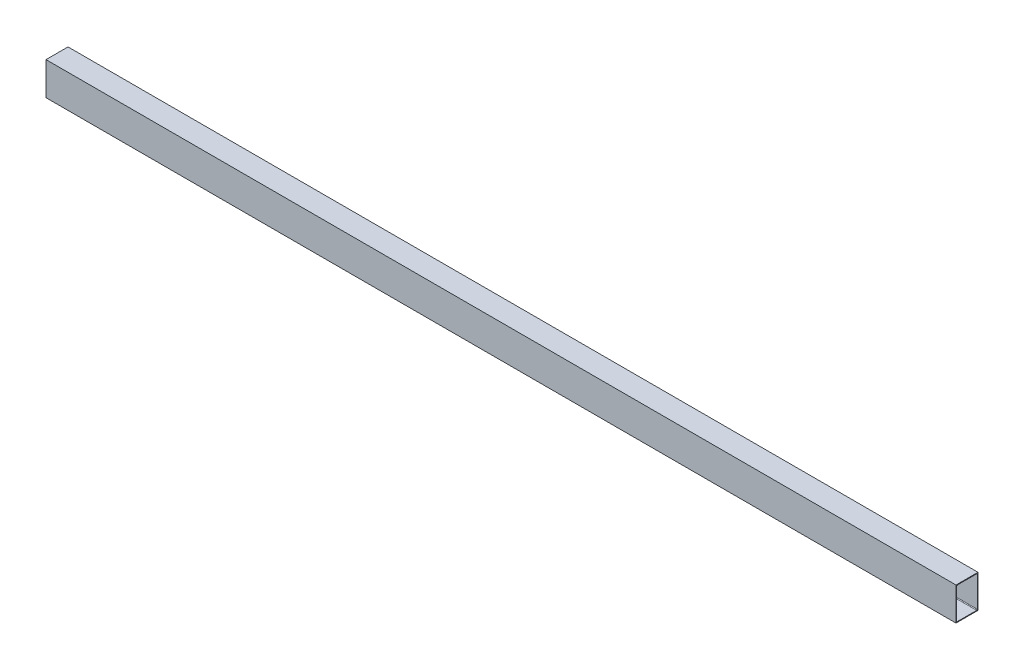
ISO-10303-21;
HEADER;
FILE_DESCRIPTION(('STEP AP214'),'2;1');
FILE_NAME('part.step','',(''),(''),'','','');
FILE_SCHEMA(('AUTOMOTIVE_DESIGN { 1 0 10303 214 1 1 1 1 }'));
ENDSEC;
DATA;
#1=APPLICATION_CONTEXT('core data for automotive mechanical design processes');
#2=APPLICATION_PROTOCOL_DEFINITION('international standard','automotive_design',2000,#1);
#3=PRODUCT_CONTEXT('',#1,'mechanical');
#4=PRODUCT('Part','Part','',(#3));
#5=PRODUCT_RELATED_PRODUCT_CATEGORY('part','',(#4));
#6=PRODUCT_DEFINITION_FORMATION('','',#4);
#7=PRODUCT_DEFINITION_CONTEXT('part definition',#1,'design');
#8=PRODUCT_DEFINITION('design','',#6,#7);
#9=PRODUCT_DEFINITION_SHAPE('','',#8);
#10=(LENGTH_UNIT() NAMED_UNIT(*) SI_UNIT(.MILLI.,.METRE.));
#11=(NAMED_UNIT(*) PLANE_ANGLE_UNIT() SI_UNIT($,.RADIAN.));
#12=(NAMED_UNIT(*) SI_UNIT($,.STERADIAN.) SOLID_ANGLE_UNIT());
#13=UNCERTAINTY_MEASURE_WITH_UNIT(LENGTH_MEASURE(1.E-05),#10,'distance_accuracy_value','');
#14=(GEOMETRIC_REPRESENTATION_CONTEXT(3) GLOBAL_UNCERTAINTY_ASSIGNED_CONTEXT((#13)) GLOBAL_UNIT_ASSIGNED_CONTEXT((#10,
#11,#12)) REPRESENTATION_CONTEXT('',''));
#15=CARTESIAN_POINT('',(0.,0.,0.));
#16=DIRECTION('',(0.,0.,1.));
#17=DIRECTION('',(1.,0.,0.));
#18=AXIS2_PLACEMENT_3D('',#15,#16,#17);
#19=CARTESIAN_POINT('',(4200.,0.,0.));
#20=DIRECTION('',(1.,0.,0.));
#21=DIRECTION('',(0.,0.,-1.));
#22=AXIS2_PLACEMENT_3D('',#19,#20,#21);
#23=PLANE('',#22);
#24=DIRECTION('',(0.,1.,0.));
#25=VECTOR('',#24,1.);
#26=CARTESIAN_POINT('',(4200.,0.,0.));
#27=LINE('',#26,#25);
#28=CARTESIAN_POINT('',(4200.,0.,0.));
#29=VERTEX_POINT('',#28);
#30=CARTESIAN_POINT('',(4200.,152.4,0.));
#31=VERTEX_POINT('',#30);
#32=EDGE_CURVE('E187',#29,#31,#27,.T.);
#33=ORIENTED_EDGE('',*,*,#32,.T.);
#34=DIRECTION('',(0.,0.,1.));
#35=VECTOR('',#34,1.);
#36=CARTESIAN_POINT('',(4200.,152.4,0.));
#37=LINE('',#36,#35);
#38=CARTESIAN_POINT('',(4200.,152.4,101.6));
#39=VERTEX_POINT('',#38);
#40=EDGE_CURVE('E190',#31,#39,#37,.T.);
#41=ORIENTED_EDGE('',*,*,#40,.T.);
#42=DIRECTION('',(0.,-1.,0.));
#43=VECTOR('',#42,1.);
#44=CARTESIAN_POINT('',(4200.,0.,101.6));
#45=LINE('',#44,#43);
#46=CARTESIAN_POINT('',(4200.,0.,101.6));
#47=VERTEX_POINT('',#46);
#48=EDGE_CURVE('E193',#39,#47,#45,.T.);
#49=ORIENTED_EDGE('',*,*,#48,.T.);
#50=DIRECTION('',(0.,0.,-1.));
#51=VECTOR('',#50,1.);
#52=CARTESIAN_POINT('',(4200.,0.,0.));
#53=LINE('',#52,#51);
#54=EDGE_CURVE('E195',#47,#29,#53,.T.);
#55=ORIENTED_EDGE('',*,*,#54,.T.);
#56=EDGE_LOOP('',(#33,#41,#49,#55));
#57=FACE_BOUND('',#56,.T.);
#58=DIRECTION('',(0.,0.,-1.));
#59=VECTOR('',#58,1.);
#60=CARTESIAN_POINT('',(4200.,3.175,6.35));
#61=LINE('',#60,#59);
#62=CARTESIAN_POINT('',(4200.,3.17499999999999,95.25));
#63=VERTEX_POINT('',#62);
#64=CARTESIAN_POINT('',(4200.,3.175,6.35));
#65=VERTEX_POINT('',#64);
#66=EDGE_CURVE('E130',#63,#65,#61,.T.);
#67=ORIENTED_EDGE('',*,*,#66,.F.);
#68=CARTESIAN_POINT('',(4200.,6.34999999999999,95.25));
#69=DIRECTION('',(1.,0.,0.));
#70=DIRECTION('',(0.,0.,-1.));
#71=AXIS2_PLACEMENT_3D('',#68,#69,#70);
#72=CIRCLE('',#71,3.17500000000001);
#73=CARTESIAN_POINT('',(4200.,6.34999999999999,98.425));
#74=VERTEX_POINT('',#73);
#75=EDGE_CURVE('E122',#74,#63,#72,.T.);
#76=ORIENTED_EDGE('',*,*,#75,.F.);
#77=DIRECTION('',(0.,-1.,0.));
#78=VECTOR('',#77,1.);
#79=CARTESIAN_POINT('',(4200.,6.34999999999999,98.425));
#80=LINE('',#79,#78);
#81=CARTESIAN_POINT('',(4200.,146.05,98.425));
#82=VERTEX_POINT('',#81);
#83=EDGE_CURVE('E155',#82,#74,#80,.T.);
#84=ORIENTED_EDGE('',*,*,#83,.F.);
#85=CARTESIAN_POINT('',(4200.,146.05,95.25));
#86=DIRECTION('',(1.,0.,0.));
#87=DIRECTION('',(0.,0.,1.));
#88=AXIS2_PLACEMENT_3D('',#85,#86,#87);
#89=CIRCLE('',#88,3.175);
#90=CARTESIAN_POINT('',(4200.,149.225,95.25));
#91=VERTEX_POINT('',#90);
#92=EDGE_CURVE('E153',#91,#82,#89,.T.);
#93=ORIENTED_EDGE('',*,*,#92,.F.);
#94=DIRECTION('',(0.,0.,1.));
#95=VECTOR('',#94,1.);
#96=CARTESIAN_POINT('',(4200.,149.225,6.35));
#97=LINE('',#96,#95);
#98=CARTESIAN_POINT('',(4200.,149.225,6.35));
#99=VERTEX_POINT('',#98);
#100=EDGE_CURVE('E151',#99,#91,#97,.T.);
#101=ORIENTED_EDGE('',*,*,#100,.F.);
#102=CARTESIAN_POINT('',(4200.,146.05,6.35));
#103=DIRECTION('',(1.,0.,0.));
#104=DIRECTION('',(0.,0.,1.));
#105=AXIS2_PLACEMENT_3D('',#102,#103,#104);
#106=CIRCLE('',#105,3.17500000000001);
#107=CARTESIAN_POINT('',(4200.,146.05,3.17499999999999));
#108=VERTEX_POINT('',#107);
#109=EDGE_CURVE('E149',#108,#99,#106,.T.);
#110=ORIENTED_EDGE('',*,*,#109,.F.);
#111=DIRECTION('',(0.,1.,0.));
#112=VECTOR('',#111,1.);
#113=CARTESIAN_POINT('',(4200.,6.35,3.175));
#114=LINE('',#113,#112);
#115=CARTESIAN_POINT('',(4200.,6.35,3.175));
#116=VERTEX_POINT('',#115);
#117=EDGE_CURVE('E145',#116,#108,#114,.T.);
#118=ORIENTED_EDGE('',*,*,#117,.F.);
#119=CARTESIAN_POINT('',(4200.,6.35,6.35));
#120=DIRECTION('',(1.,0.,0.));
#121=DIRECTION('',(0.,0.,1.));
#122=AXIS2_PLACEMENT_3D('',#119,#120,#121);
#123=CIRCLE('',#122,3.175);
#124=EDGE_CURVE('E143',#65,#116,#123,.T.);
#125=ORIENTED_EDGE('',*,*,#124,.F.);
#126=EDGE_LOOP('',(#67,#76,#84,#93,#101,#110,#118,#125));
#127=FACE_BOUND('',#126,.T.);
#128=ADVANCED_FACE('F33',(#57,#127),#23,.T.);
#129=CARTESIAN_POINT('',(0.,0.,0.));
#130=DIRECTION('',(1.,0.,0.));
#131=DIRECTION('',(0.,0.,-1.));
#132=AXIS2_PLACEMENT_3D('',#129,#130,#131);
#133=PLANE('',#132);
#134=DIRECTION('',(0.,1.,0.));
#135=VECTOR('',#134,1.);
#136=CARTESIAN_POINT('',(0.,0.,0.));
#137=LINE('',#136,#135);
#138=CARTESIAN_POINT('',(0.,0.,0.));
#139=VERTEX_POINT('',#138);
#140=CARTESIAN_POINT('',(0.,152.4,0.));
#141=VERTEX_POINT('',#140);
#142=EDGE_CURVE('E138',#139,#141,#137,.T.);
#143=ORIENTED_EDGE('',*,*,#142,.F.);
#144=DIRECTION('',(0.,0.,-1.));
#145=VECTOR('',#144,1.);
#146=CARTESIAN_POINT('',(0.,0.,0.));
#147=LINE('',#146,#145);
#148=CARTESIAN_POINT('',(0.,0.,101.6));
#149=VERTEX_POINT('',#148);
#150=EDGE_CURVE('E191',#149,#139,#147,.T.);
#151=ORIENTED_EDGE('',*,*,#150,.F.);
#152=DIRECTION('',(0.,-1.,0.));
#153=VECTOR('',#152,1.);
#154=CARTESIAN_POINT('',(0.,0.,101.6));
#155=LINE('',#154,#153);
#156=CARTESIAN_POINT('',(0.,152.4,101.6));
#157=VERTEX_POINT('',#156);
#158=EDGE_CURVE('E202',#157,#149,#155,.T.);
#159=ORIENTED_EDGE('',*,*,#158,.F.);
#160=DIRECTION('',(0.,0.,1.));
#161=VECTOR('',#160,1.);
#162=CARTESIAN_POINT('',(0.,152.4,0.));
#163=LINE('',#162,#161);
#164=EDGE_CURVE('E200',#141,#157,#163,.T.);
#165=ORIENTED_EDGE('',*,*,#164,.F.);
#166=EDGE_LOOP('',(#143,#151,#159,#165));
#167=FACE_BOUND('',#166,.T.);
#168=CARTESIAN_POINT('',(0.,6.34999999999999,95.25));
#169=DIRECTION('',(1.,0.,0.));
#170=DIRECTION('',(0.,0.,-1.));
#171=AXIS2_PLACEMENT_3D('',#168,#169,#170);
#172=CIRCLE('',#171,3.17500000000001);
#173=CARTESIAN_POINT('',(0.,6.34999999999999,98.425));
#174=VERTEX_POINT('',#173);
#175=CARTESIAN_POINT('',(0.,3.17499999999999,95.25));
#176=VERTEX_POINT('',#175);
#177=EDGE_CURVE('E56',#174,#176,#172,.T.);
#178=ORIENTED_EDGE('',*,*,#177,.T.);
#179=DIRECTION('',(0.,0.,-1.));
#180=VECTOR('',#179,1.);
#181=CARTESIAN_POINT('',(0.,3.175,6.35));
#182=LINE('',#181,#180);
#183=CARTESIAN_POINT('',(0.,3.175,6.35));
#184=VERTEX_POINT('',#183);
#185=EDGE_CURVE('E137',#176,#184,#182,.T.);
#186=ORIENTED_EDGE('',*,*,#185,.T.);
#187=CARTESIAN_POINT('',(0.,6.35,6.35));
#188=DIRECTION('',(1.,0.,0.));
#189=DIRECTION('',(0.,0.,1.));
#190=AXIS2_PLACEMENT_3D('',#187,#188,#189);
#191=CIRCLE('',#190,3.175);
#192=CARTESIAN_POINT('',(0.,6.35,3.175));
#193=VERTEX_POINT('',#192);
#194=EDGE_CURVE('E159',#184,#193,#191,.T.);
#195=ORIENTED_EDGE('',*,*,#194,.T.);
#196=DIRECTION('',(0.,1.,0.));
#197=VECTOR('',#196,1.);
#198=CARTESIAN_POINT('',(0.,6.35,3.175));
#199=LINE('',#198,#197);
#200=CARTESIAN_POINT('',(0.,146.05,3.17499999999999));
#201=VERTEX_POINT('',#200);
#202=EDGE_CURVE('E162',#193,#201,#199,.T.);
#203=ORIENTED_EDGE('',*,*,#202,.T.);
#204=CARTESIAN_POINT('',(0.,146.05,6.35));
#205=DIRECTION('',(1.,0.,0.));
#206=DIRECTION('',(0.,0.,1.));
#207=AXIS2_PLACEMENT_3D('',#204,#205,#206);
#208=CIRCLE('',#207,3.17500000000001);
#209=CARTESIAN_POINT('',(0.,149.225,6.35));
#210=VERTEX_POINT('',#209);
#211=EDGE_CURVE('E165',#201,#210,#208,.T.);
#212=ORIENTED_EDGE('',*,*,#211,.T.);
#213=DIRECTION('',(0.,0.,1.));
#214=VECTOR('',#213,1.);
#215=CARTESIAN_POINT('',(0.,149.225,6.35));
#216=LINE('',#215,#214);
#217=CARTESIAN_POINT('',(0.,149.225,95.25));
#218=VERTEX_POINT('',#217);
#219=EDGE_CURVE('E168',#210,#218,#216,.T.);
#220=ORIENTED_EDGE('',*,*,#219,.T.);
#221=CARTESIAN_POINT('',(0.,146.05,95.25));
#222=DIRECTION('',(1.,0.,0.));
#223=DIRECTION('',(0.,0.,1.));
#224=AXIS2_PLACEMENT_3D('',#221,#222,#223);
#225=CIRCLE('',#224,3.175);
#226=CARTESIAN_POINT('',(0.,146.05,98.425));
#227=VERTEX_POINT('',#226);
#228=EDGE_CURVE('E171',#218,#227,#225,.T.);
#229=ORIENTED_EDGE('',*,*,#228,.T.);
#230=DIRECTION('',(0.,-1.,0.));
#231=VECTOR('',#230,1.);
#232=CARTESIAN_POINT('',(0.,6.34999999999999,98.425));
#233=LINE('',#232,#231);
#234=EDGE_CURVE('E131',#227,#174,#233,.T.);
#235=ORIENTED_EDGE('',*,*,#234,.T.);
#236=EDGE_LOOP('',(#178,#186,#195,#203,#212,#220,#229,#235));
#237=FACE_BOUND('',#236,.T.);
#238=ADVANCED_FACE('F220',(#167,#237),#133,.F.);
#239=CARTESIAN_POINT('',(4200.,0.,0.));
#240=DIRECTION('',(0.,0.,1.));
#241=DIRECTION('',(1.,0.,0.));
#242=AXIS2_PLACEMENT_3D('',#239,#240,#241);
#243=PLANE('',#242);
#244=ORIENTED_EDGE('',*,*,#142,.T.);
#245=DIRECTION('',(-1.,0.,0.));
#246=VECTOR('',#245,1.);
#247=CARTESIAN_POINT('',(4200.,152.4,0.));
#248=LINE('',#247,#246);
#249=EDGE_CURVE('E11',#31,#141,#248,.T.);
#250=ORIENTED_EDGE('',*,*,#249,.F.);
#251=ORIENTED_EDGE('',*,*,#32,.F.);
#252=DIRECTION('',(-1.,0.,0.));
#253=VECTOR('',#252,1.);
#254=CARTESIAN_POINT('',(4200.,0.,0.));
#255=LINE('',#254,#253);
#256=EDGE_CURVE('E197',#29,#139,#255,.T.);
#257=ORIENTED_EDGE('',*,*,#256,.T.);
#258=EDGE_LOOP('',(#244,#250,#251,#257));
#259=FACE_BOUND('',#258,.T.);
#260=ADVANCED_FACE('F35',(#259),#243,.F.);
#261=CARTESIAN_POINT('',(4200.,152.4,0.));
#262=DIRECTION('',(0.,-1.,0.));
#263=DIRECTION('',(0.,0.,-1.));
#264=AXIS2_PLACEMENT_3D('',#261,#262,#263);
#265=PLANE('',#264);
#266=ORIENTED_EDGE('',*,*,#164,.T.);
#267=DIRECTION('',(-1.,0.,0.));
#268=VECTOR('',#267,1.);
#269=CARTESIAN_POINT('',(4200.,152.4,101.6));
#270=LINE('',#269,#268);
#271=EDGE_CURVE('E41',#39,#157,#270,.T.);
#272=ORIENTED_EDGE('',*,*,#271,.F.);
#273=ORIENTED_EDGE('',*,*,#40,.F.);
#274=ORIENTED_EDGE('',*,*,#249,.T.);
#275=EDGE_LOOP('',(#266,#272,#273,#274));
#276=FACE_BOUND('',#275,.T.);
#277=ADVANCED_FACE('F230',(#276),#265,.F.);
#278=CARTESIAN_POINT('',(4200.,0.,101.6));
#279=DIRECTION('',(0.,0.,-1.));
#280=DIRECTION('',(-1.,0.,0.));
#281=AXIS2_PLACEMENT_3D('',#278,#279,#280);
#282=PLANE('',#281);
#283=ORIENTED_EDGE('',*,*,#158,.T.);
#284=DIRECTION('',(-1.,0.,0.));
#285=VECTOR('',#284,1.);
#286=CARTESIAN_POINT('',(4200.,0.,101.6));
#287=LINE('',#286,#285);
#288=EDGE_CURVE('E207',#47,#149,#287,.T.);
#289=ORIENTED_EDGE('',*,*,#288,.F.);
#290=ORIENTED_EDGE('',*,*,#48,.F.);
#291=ORIENTED_EDGE('',*,*,#271,.T.);
#292=EDGE_LOOP('',(#283,#289,#290,#291));
#293=FACE_BOUND('',#292,.T.);
#294=ADVANCED_FACE('F214',(#293),#282,.F.);
#295=CARTESIAN_POINT('',(4200.,0.,0.));
#296=DIRECTION('',(0.,1.,0.));
#297=DIRECTION('',(0.,0.,1.));
#298=AXIS2_PLACEMENT_3D('',#295,#296,#297);
#299=PLANE('',#298);
#300=ORIENTED_EDGE('',*,*,#150,.T.);
#301=ORIENTED_EDGE('',*,*,#256,.F.);
#302=ORIENTED_EDGE('',*,*,#54,.F.);
#303=ORIENTED_EDGE('',*,*,#288,.T.);
#304=EDGE_LOOP('',(#300,#301,#302,#303));
#305=FACE_BOUND('',#304,.T.);
#306=ADVANCED_FACE('F224',(#305),#299,.F.);
#307=CARTESIAN_POINT('',(4200.,6.34999999999999,95.25));
#308=DIRECTION('',(-1.,0.,0.));
#309=DIRECTION('',(0.,0.,1.));
#310=AXIS2_PLACEMENT_3D('',#307,#308,#309);
#311=CYLINDRICAL_SURFACE('',#310,3.17500000000001);
#312=ORIENTED_EDGE('',*,*,#177,.F.);
#313=DIRECTION('',(-1.,0.,0.));
#314=VECTOR('',#313,1.);
#315=CARTESIAN_POINT('',(4200.,6.34999999999999,98.425));
#316=LINE('',#315,#314);
#317=EDGE_CURVE('E126',#74,#174,#316,.T.);
#318=ORIENTED_EDGE('',*,*,#317,.F.);
#319=ORIENTED_EDGE('',*,*,#75,.T.);
#320=DIRECTION('',(-1.,0.,0.));
#321=VECTOR('',#320,1.);
#322=CARTESIAN_POINT('',(4200.,3.17499999999999,95.25));
#323=LINE('',#322,#321);
#324=EDGE_CURVE('E125',#63,#176,#323,.T.);
#325=ORIENTED_EDGE('',*,*,#324,.T.);
#326=EDGE_LOOP('',(#312,#318,#319,#325));
#327=FACE_BOUND('',#326,.T.);
#328=ADVANCED_FACE('F124',(#327),#311,.F.);
#329=CARTESIAN_POINT('',(4200.,3.175,6.35));
#330=DIRECTION('',(0.,1.,0.));
#331=DIRECTION('',(0.,0.,1.));
#332=AXIS2_PLACEMENT_3D('',#329,#330,#331);
#333=PLANE('',#332);
#334=ORIENTED_EDGE('',*,*,#185,.F.);
#335=ORIENTED_EDGE('',*,*,#324,.F.);
#336=ORIENTED_EDGE('',*,*,#66,.T.);
#337=DIRECTION('',(-1.,0.,0.));
#338=VECTOR('',#337,1.);
#339=CARTESIAN_POINT('',(4200.,3.175,6.35));
#340=LINE('',#339,#338);
#341=EDGE_CURVE('E139',#65,#184,#340,.T.);
#342=ORIENTED_EDGE('',*,*,#341,.T.);
#343=EDGE_LOOP('',(#334,#335,#336,#342));
#344=FACE_BOUND('',#343,.T.);
#345=ADVANCED_FACE('F134',(#344),#333,.T.);
#346=CARTESIAN_POINT('',(4200.,6.35,6.35));
#347=DIRECTION('',(-1.,0.,0.));
#348=DIRECTION('',(0.,0.,1.));
#349=AXIS2_PLACEMENT_3D('',#346,#347,#348);
#350=CYLINDRICAL_SURFACE('',#349,3.175);
#351=ORIENTED_EDGE('',*,*,#194,.F.);
#352=ORIENTED_EDGE('',*,*,#341,.F.);
#353=ORIENTED_EDGE('',*,*,#124,.T.);
#354=DIRECTION('',(-1.,0.,0.));
#355=VECTOR('',#354,1.);
#356=CARTESIAN_POINT('',(4200.,6.35,3.175));
#357=LINE('',#356,#355);
#358=EDGE_CURVE('E184',#116,#193,#357,.T.);
#359=ORIENTED_EDGE('',*,*,#358,.T.);
#360=EDGE_LOOP('',(#351,#352,#353,#359));
#361=FACE_BOUND('',#360,.T.);
#362=ADVANCED_FACE('F253',(#361),#350,.F.);
#363=CARTESIAN_POINT('',(4200.,6.35,3.175));
#364=DIRECTION('',(0.,0.,1.));
#365=DIRECTION('',(0.,-1.,0.));
#366=AXIS2_PLACEMENT_3D('',#363,#364,#365);
#367=PLANE('',#366);
#368=ORIENTED_EDGE('',*,*,#202,.F.);
#369=ORIENTED_EDGE('',*,*,#358,.F.);
#370=ORIENTED_EDGE('',*,*,#117,.T.);
#371=DIRECTION('',(-1.,0.,0.));
#372=VECTOR('',#371,1.);
#373=CARTESIAN_POINT('',(4200.,146.05,3.17499999999999));
#374=LINE('',#373,#372);
#375=EDGE_CURVE('E182',#108,#201,#374,.T.);
#376=ORIENTED_EDGE('',*,*,#375,.T.);
#377=EDGE_LOOP('',(#368,#369,#370,#376));
#378=FACE_BOUND('',#377,.T.);
#379=ADVANCED_FACE('F257',(#378),#367,.T.);
#380=CARTESIAN_POINT('',(4200.,146.05,6.35));
#381=DIRECTION('',(-1.,0.,0.));
#382=DIRECTION('',(0.,0.,1.));
#383=AXIS2_PLACEMENT_3D('',#380,#381,#382);
#384=CYLINDRICAL_SURFACE('',#383,3.17500000000001);
#385=ORIENTED_EDGE('',*,*,#211,.F.);
#386=ORIENTED_EDGE('',*,*,#375,.F.);
#387=ORIENTED_EDGE('',*,*,#109,.T.);
#388=DIRECTION('',(-1.,0.,0.));
#389=VECTOR('',#388,1.);
#390=CARTESIAN_POINT('',(4200.,149.225,6.35));
#391=LINE('',#390,#389);
#392=EDGE_CURVE('E180',#99,#210,#391,.T.);
#393=ORIENTED_EDGE('',*,*,#392,.T.);
#394=EDGE_LOOP('',(#385,#386,#387,#393));
#395=FACE_BOUND('',#394,.T.);
#396=ADVANCED_FACE('F263',(#395),#384,.F.);
#397=CARTESIAN_POINT('',(4200.,149.225,6.35));
#398=DIRECTION('',(0.,-1.,0.));
#399=DIRECTION('',(0.,0.,-1.));
#400=AXIS2_PLACEMENT_3D('',#397,#398,#399);
#401=PLANE('',#400);
#402=ORIENTED_EDGE('',*,*,#219,.F.);
#403=ORIENTED_EDGE('',*,*,#392,.F.);
#404=ORIENTED_EDGE('',*,*,#100,.T.);
#405=DIRECTION('',(-1.,0.,0.));
#406=VECTOR('',#405,1.);
#407=CARTESIAN_POINT('',(4200.,149.225,95.25));
#408=LINE('',#407,#406);
#409=EDGE_CURVE('E178',#91,#218,#408,.T.);
#410=ORIENTED_EDGE('',*,*,#409,.T.);
#411=EDGE_LOOP('',(#402,#403,#404,#410));
#412=FACE_BOUND('',#411,.T.);
#413=ADVANCED_FACE('F267',(#412),#401,.T.);
#414=CARTESIAN_POINT('',(4200.,146.05,95.25));
#415=DIRECTION('',(-1.,0.,0.));
#416=DIRECTION('',(0.,0.,1.));
#417=AXIS2_PLACEMENT_3D('',#414,#415,#416);
#418=CYLINDRICAL_SURFACE('',#417,3.175);
#419=ORIENTED_EDGE('',*,*,#228,.F.);
#420=ORIENTED_EDGE('',*,*,#409,.F.);
#421=ORIENTED_EDGE('',*,*,#92,.T.);
#422=DIRECTION('',(-1.,0.,0.));
#423=VECTOR('',#422,1.);
#424=CARTESIAN_POINT('',(4200.,146.05,98.425));
#425=LINE('',#424,#423);
#426=EDGE_CURVE('E48',#82,#227,#425,.T.);
#427=ORIENTED_EDGE('',*,*,#426,.T.);
#428=EDGE_LOOP('',(#419,#420,#421,#427));
#429=FACE_BOUND('',#428,.T.);
#430=ADVANCED_FACE('F271',(#429),#418,.F.);
#431=CARTESIAN_POINT('',(4200.,6.34999999999999,98.425));
#432=DIRECTION('',(0.,0.,-1.));
#433=DIRECTION('',(0.,1.,0.));
#434=AXIS2_PLACEMENT_3D('',#431,#432,#433);
#435=PLANE('',#434);
#436=ORIENTED_EDGE('',*,*,#234,.F.);
#437=ORIENTED_EDGE('',*,*,#426,.F.);
#438=ORIENTED_EDGE('',*,*,#83,.T.);
#439=ORIENTED_EDGE('',*,*,#317,.T.);
#440=EDGE_LOOP('',(#436,#437,#438,#439));
#441=FACE_BOUND('',#440,.T.);
#442=ADVANCED_FACE('F275',(#441),#435,.T.);
#443=CLOSED_SHELL('',(#128,#238,#260,#277,#294,#306,#328,#345,#362,#379,#396,#413,#430,#442));
#444=MANIFOLD_SOLID_BREP('B2',#443);
#445=ADVANCED_BREP_SHAPE_REPRESENTATION('',(#18,#444),#14);
#446=SHAPE_DEFINITION_REPRESENTATION(#9,#445);
ENDSEC;
END-ISO-10303-21;
